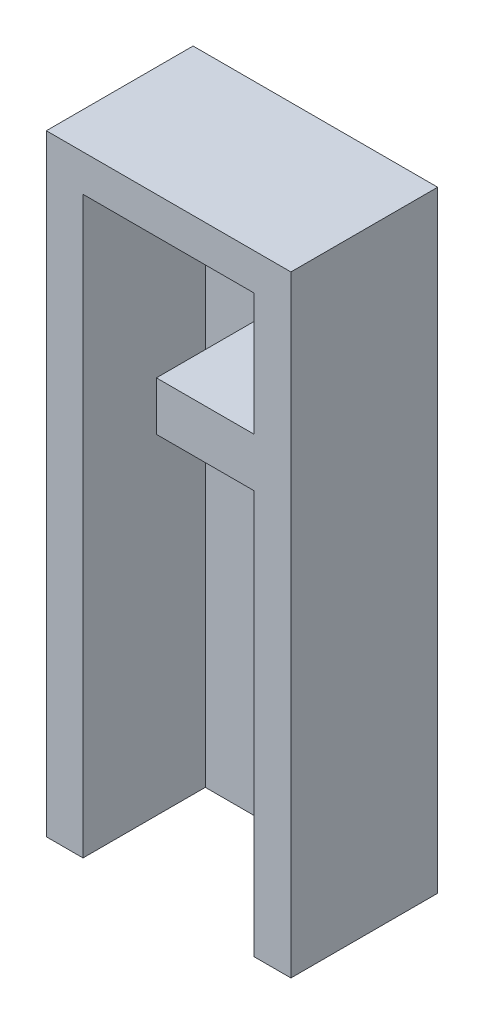
ISO-10303-21;
HEADER;
FILE_DESCRIPTION(('STEP AP214'),'2;1');
FILE_NAME('part.step','',(''),(''),'','','');
FILE_SCHEMA(('AUTOMOTIVE_DESIGN { 1 0 10303 214 1 1 1 1 }'));
ENDSEC;
DATA;
#1=APPLICATION_CONTEXT('core data for automotive mechanical design processes');
#2=APPLICATION_PROTOCOL_DEFINITION('international standard','automotive_design',2000,#1);
#3=PRODUCT_CONTEXT('',#1,'mechanical');
#4=PRODUCT('Part','Part','',(#3));
#5=PRODUCT_RELATED_PRODUCT_CATEGORY('part','',(#4));
#6=PRODUCT_DEFINITION_FORMATION('','',#4);
#7=PRODUCT_DEFINITION_CONTEXT('part definition',#1,'design');
#8=PRODUCT_DEFINITION('design','',#6,#7);
#9=PRODUCT_DEFINITION_SHAPE('','',#8);
#10=(LENGTH_UNIT() NAMED_UNIT(*) SI_UNIT(.MILLI.,.METRE.));
#11=(NAMED_UNIT(*) PLANE_ANGLE_UNIT() SI_UNIT($,.RADIAN.));
#12=(NAMED_UNIT(*) SI_UNIT($,.STERADIAN.) SOLID_ANGLE_UNIT());
#13=UNCERTAINTY_MEASURE_WITH_UNIT(LENGTH_MEASURE(1.E-05),#10,'distance_accuracy_value','');
#14=(GEOMETRIC_REPRESENTATION_CONTEXT(3) GLOBAL_UNCERTAINTY_ASSIGNED_CONTEXT((#13)) GLOBAL_UNIT_ASSIGNED_CONTEXT((#10,
#11,#12)) REPRESENTATION_CONTEXT('',''));
#15=CARTESIAN_POINT('',(0.,0.,0.));
#16=DIRECTION('',(0.,0.,1.));
#17=DIRECTION('',(1.,0.,0.));
#18=AXIS2_PLACEMENT_3D('',#15,#16,#17);
#19=CARTESIAN_POINT('',(0.,0.,5.));
#20=DIRECTION('',(0.,0.,-1.));
#21=DIRECTION('',(-1.,0.,0.));
#22=AXIS2_PLACEMENT_3D('',#19,#20,#21);
#23=PLANE('',#22);
#24=DIRECTION('',(1.,0.,0.));
#25=VECTOR('',#24,1.);
#26=CARTESIAN_POINT('',(-1.5,-1.5,5.));
#27=LINE('',#26,#25);
#28=CARTESIAN_POINT('',(-1.5,-1.5,5.));
#29=VERTEX_POINT('',#28);
#30=CARTESIAN_POINT('',(0.,-1.5,5.));
#31=VERTEX_POINT('',#30);
#32=EDGE_CURVE('E140',#29,#31,#27,.T.);
#33=ORIENTED_EDGE('',*,*,#32,.T.);
#34=DIRECTION('',(0.,-1.,0.));
#35=VECTOR('',#34,1.);
#36=CARTESIAN_POINT('',(0.,0.,5.));
#37=LINE('',#36,#35);
#38=CARTESIAN_POINT('',(0.,22.,5.));
#39=VERTEX_POINT('',#38);
#40=EDGE_CURVE('E126',#39,#31,#37,.T.);
#41=ORIENTED_EDGE('',*,*,#40,.F.);
#42=DIRECTION('',(-1.,0.,0.));
#43=VECTOR('',#42,1.);
#44=CARTESIAN_POINT('',(0.,22.,5.));
#45=LINE('',#44,#43);
#46=CARTESIAN_POINT('',(7.,22.,5.));
#47=VERTEX_POINT('',#46);
#48=EDGE_CURVE('E196',#47,#39,#45,.T.);
#49=ORIENTED_EDGE('',*,*,#48,.F.);
#50=DIRECTION('',(0.,1.,0.));
#51=VECTOR('',#50,1.);
#52=CARTESIAN_POINT('',(7.,17.,5.));
#53=LINE('',#52,#51);
#54=CARTESIAN_POINT('',(7.,17.,5.));
#55=VERTEX_POINT('',#54);
#56=EDGE_CURVE('E194',#55,#47,#53,.T.);
#57=ORIENTED_EDGE('',*,*,#56,.F.);
#58=DIRECTION('',(1.,0.,0.));
#59=VECTOR('',#58,1.);
#60=CARTESIAN_POINT('',(7.,17.,5.));
#61=LINE('',#60,#59);
#62=CARTESIAN_POINT('',(3.,17.,5.));
#63=VERTEX_POINT('',#62);
#64=EDGE_CURVE('E192',#63,#55,#61,.T.);
#65=ORIENTED_EDGE('',*,*,#64,.F.);
#66=DIRECTION('',(0.,1.,0.));
#67=VECTOR('',#66,1.);
#68=CARTESIAN_POINT('',(3.,17.,5.));
#69=LINE('',#68,#67);
#70=CARTESIAN_POINT('',(3.,15.,5.));
#71=VERTEX_POINT('',#70);
#72=EDGE_CURVE('E190',#71,#63,#69,.T.);
#73=ORIENTED_EDGE('',*,*,#72,.F.);
#74=DIRECTION('',(-1.,0.,0.));
#75=VECTOR('',#74,1.);
#76=CARTESIAN_POINT('',(3.,15.,5.));
#77=LINE('',#76,#75);
#78=CARTESIAN_POINT('',(7.,15.,5.));
#79=VERTEX_POINT('',#78);
#80=EDGE_CURVE('E188',#79,#71,#77,.T.);
#81=ORIENTED_EDGE('',*,*,#80,.F.);
#82=DIRECTION('',(0.,1.,0.));
#83=VECTOR('',#82,1.);
#84=CARTESIAN_POINT('',(7.,0.,5.));
#85=LINE('',#84,#83);
#86=CARTESIAN_POINT('',(7.,-1.5,5.));
#87=VERTEX_POINT('',#86);
#88=EDGE_CURVE('E135',#87,#79,#85,.T.);
#89=ORIENTED_EDGE('',*,*,#88,.F.);
#90=CARTESIAN_POINT('',(8.5,-1.5,5.));
#91=VERTEX_POINT('',#90);
#92=EDGE_CURVE('E151',#87,#91,#27,.T.);
#93=ORIENTED_EDGE('',*,*,#92,.T.);
#94=DIRECTION('',(0.,1.,0.));
#95=VECTOR('',#94,1.);
#96=CARTESIAN_POINT('',(8.5,-1.5,5.));
#97=LINE('',#96,#95);
#98=CARTESIAN_POINT('',(8.5,23.5,5.));
#99=VERTEX_POINT('',#98);
#100=EDGE_CURVE('E150',#91,#99,#97,.T.);
#101=ORIENTED_EDGE('',*,*,#100,.T.);
#102=DIRECTION('',(-1.,0.,0.));
#103=VECTOR('',#102,1.);
#104=CARTESIAN_POINT('',(-1.5,23.5,5.));
#105=LINE('',#104,#103);
#106=CARTESIAN_POINT('',(-1.5,23.5,5.));
#107=VERTEX_POINT('',#106);
#108=EDGE_CURVE('E153',#99,#107,#105,.T.);
#109=ORIENTED_EDGE('',*,*,#108,.T.);
#110=DIRECTION('',(0.,-1.,0.));
#111=VECTOR('',#110,1.);
#112=CARTESIAN_POINT('',(-1.5,-1.5,5.));
#113=LINE('',#112,#111);
#114=EDGE_CURVE('E148',#107,#29,#113,.T.);
#115=ORIENTED_EDGE('',*,*,#114,.T.);
#116=EDGE_LOOP('',(#33,#41,#49,#57,#65,#73,#81,#89,#93,#101,#109,#115));
#117=FACE_BOUND('',#116,.T.);
#118=ADVANCED_FACE('F39',(#117),#23,.F.);
#119=CARTESIAN_POINT('',(-1.5,-1.5,5.));
#120=DIRECTION('',(1.,0.,0.));
#121=DIRECTION('',(0.,0.,-1.));
#122=AXIS2_PLACEMENT_3D('',#119,#120,#121);
#123=PLANE('',#122);
#124=DIRECTION('',(0.,0.,-1.));
#125=VECTOR('',#124,1.);
#126=CARTESIAN_POINT('',(-1.5,23.5,5.));
#127=LINE('',#126,#125);
#128=CARTESIAN_POINT('',(-1.5,23.5,-1.));
#129=VERTEX_POINT('',#128);
#130=EDGE_CURVE('E159',#107,#129,#127,.T.);
#131=ORIENTED_EDGE('',*,*,#130,.T.);
#132=DIRECTION('',(0.,1.,0.));
#133=VECTOR('',#132,1.);
#134=CARTESIAN_POINT('',(-1.5,23.5,-1.));
#135=LINE('',#134,#133);
#136=CARTESIAN_POINT('',(-1.5,-1.5,-1.));
#137=VERTEX_POINT('',#136);
#138=EDGE_CURVE('E176',#137,#129,#135,.T.);
#139=ORIENTED_EDGE('',*,*,#138,.F.);
#140=DIRECTION('',(0.,0.,-1.));
#141=VECTOR('',#140,1.);
#142=CARTESIAN_POINT('',(-1.5,-1.5,5.));
#143=LINE('',#142,#141);
#144=EDGE_CURVE('E11',#29,#137,#143,.T.);
#145=ORIENTED_EDGE('',*,*,#144,.F.);
#146=ORIENTED_EDGE('',*,*,#114,.F.);
#147=EDGE_LOOP('',(#131,#139,#145,#146));
#148=FACE_BOUND('',#147,.T.);
#149=ADVANCED_FACE('F41',(#148),#123,.F.);
#150=CARTESIAN_POINT('',(-1.5,-1.5,5.));
#151=DIRECTION('',(0.,1.,0.));
#152=DIRECTION('',(0.,0.,1.));
#153=AXIS2_PLACEMENT_3D('',#150,#151,#152);
#154=PLANE('',#153);
#155=DIRECTION('',(-1.,0.,0.));
#156=VECTOR('',#155,1.);
#157=CARTESIAN_POINT('',(-1.5,-1.5,0.));
#158=LINE('',#157,#156);
#159=CARTESIAN_POINT('',(7.,-1.5,0.));
#160=VERTEX_POINT('',#159);
#161=CARTESIAN_POINT('',(0.,-1.5,0.));
#162=VERTEX_POINT('',#161);
#163=EDGE_CURVE('E144',#160,#162,#158,.T.);
#164=ORIENTED_EDGE('',*,*,#163,.T.);
#165=DIRECTION('',(0.,0.,1.));
#166=VECTOR('',#165,1.);
#167=CARTESIAN_POINT('',(0.,-1.5,5.));
#168=LINE('',#167,#166);
#169=EDGE_CURVE('E129',#162,#31,#168,.T.);
#170=ORIENTED_EDGE('',*,*,#169,.T.);
#171=ORIENTED_EDGE('',*,*,#32,.F.);
#172=ORIENTED_EDGE('',*,*,#144,.T.);
#173=DIRECTION('',(-1.,0.,0.));
#174=VECTOR('',#173,1.);
#175=CARTESIAN_POINT('',(8.5,-1.5,-1.));
#176=LINE('',#175,#174);
#177=CARTESIAN_POINT('',(8.5,-1.5,-1.));
#178=VERTEX_POINT('',#177);
#179=EDGE_CURVE('E172',#178,#137,#176,.T.);
#180=ORIENTED_EDGE('',*,*,#179,.F.);
#181=DIRECTION('',(0.,0.,-1.));
#182=VECTOR('',#181,1.);
#183=CARTESIAN_POINT('',(8.5,-1.5,5.));
#184=LINE('',#183,#182);
#185=EDGE_CURVE('E47',#91,#178,#184,.T.);
#186=ORIENTED_EDGE('',*,*,#185,.F.);
#187=ORIENTED_EDGE('',*,*,#92,.F.);
#188=DIRECTION('',(0.,0.,-1.));
#189=VECTOR('',#188,1.);
#190=CARTESIAN_POINT('',(7.,-1.5,5.));
#191=LINE('',#190,#189);
#192=EDGE_CURVE('E236',#87,#160,#191,.T.);
#193=ORIENTED_EDGE('',*,*,#192,.T.);
#194=EDGE_LOOP('',(#164,#170,#171,#172,#180,#186,#187,#193));
#195=FACE_BOUND('',#194,.T.);
#196=ADVANCED_FACE('F139',(#195),#154,.F.);
#197=CARTESIAN_POINT('',(8.5,-1.5,5.));
#198=DIRECTION('',(-1.,0.,0.));
#199=DIRECTION('',(0.,0.,1.));
#200=AXIS2_PLACEMENT_3D('',#197,#198,#199);
#201=PLANE('',#200);
#202=ORIENTED_EDGE('',*,*,#185,.T.);
#203=DIRECTION('',(0.,-1.,0.));
#204=VECTOR('',#203,1.);
#205=CARTESIAN_POINT('',(8.5,23.5,-1.));
#206=LINE('',#205,#204);
#207=CARTESIAN_POINT('',(8.5,23.5,-1.));
#208=VERTEX_POINT('',#207);
#209=EDGE_CURVE('E145',#208,#178,#206,.T.);
#210=ORIENTED_EDGE('',*,*,#209,.F.);
#211=DIRECTION('',(0.,0.,-1.));
#212=VECTOR('',#211,1.);
#213=CARTESIAN_POINT('',(8.5,23.5,5.));
#214=LINE('',#213,#212);
#215=EDGE_CURVE('E161',#99,#208,#214,.T.);
#216=ORIENTED_EDGE('',*,*,#215,.F.);
#217=ORIENTED_EDGE('',*,*,#100,.F.);
#218=EDGE_LOOP('',(#202,#210,#216,#217));
#219=FACE_BOUND('',#218,.T.);
#220=ADVANCED_FACE('F167',(#219),#201,.F.);
#221=CARTESIAN_POINT('',(-1.5,23.5,5.));
#222=DIRECTION('',(0.,-1.,0.));
#223=DIRECTION('',(0.,0.,-1.));
#224=AXIS2_PLACEMENT_3D('',#221,#222,#223);
#225=PLANE('',#224);
#226=ORIENTED_EDGE('',*,*,#215,.T.);
#227=DIRECTION('',(1.,0.,0.));
#228=VECTOR('',#227,1.);
#229=CARTESIAN_POINT('',(8.5,23.5,-1.));
#230=LINE('',#229,#228);
#231=EDGE_CURVE('E181',#129,#208,#230,.T.);
#232=ORIENTED_EDGE('',*,*,#231,.F.);
#233=ORIENTED_EDGE('',*,*,#130,.F.);
#234=ORIENTED_EDGE('',*,*,#108,.F.);
#235=EDGE_LOOP('',(#226,#232,#233,#234));
#236=FACE_BOUND('',#235,.T.);
#237=ADVANCED_FACE('F269',(#236),#225,.F.);
#238=CARTESIAN_POINT('',(0.,0.,5.));
#239=DIRECTION('',(1.,0.,0.));
#240=DIRECTION('',(0.,0.,-1.));
#241=AXIS2_PLACEMENT_3D('',#238,#239,#240);
#242=PLANE('',#241);
#243=DIRECTION('',(0.,-1.,0.));
#244=VECTOR('',#243,1.);
#245=CARTESIAN_POINT('',(0.,0.,0.));
#246=LINE('',#245,#244);
#247=CARTESIAN_POINT('',(0.,22.,0.));
#248=VERTEX_POINT('',#247);
#249=EDGE_CURVE('E62',#248,#162,#246,.T.);
#250=ORIENTED_EDGE('',*,*,#249,.F.);
#251=DIRECTION('',(0.,0.,-1.));
#252=VECTOR('',#251,1.);
#253=CARTESIAN_POINT('',(0.,22.,5.));
#254=LINE('',#253,#252);
#255=EDGE_CURVE('E131',#39,#248,#254,.T.);
#256=ORIENTED_EDGE('',*,*,#255,.F.);
#257=ORIENTED_EDGE('',*,*,#40,.T.);
#258=ORIENTED_EDGE('',*,*,#169,.F.);
#259=EDGE_LOOP('',(#250,#256,#257,#258));
#260=FACE_BOUND('',#259,.T.);
#261=ADVANCED_FACE('F128',(#260),#242,.T.);
#262=CARTESIAN_POINT('',(7.,0.,5.));
#263=DIRECTION('',(-1.,0.,0.));
#264=DIRECTION('',(0.,0.,1.));
#265=AXIS2_PLACEMENT_3D('',#262,#263,#264);
#266=PLANE('',#265);
#267=DIRECTION('',(0.,1.,0.));
#268=VECTOR('',#267,1.);
#269=CARTESIAN_POINT('',(7.,0.,0.));
#270=LINE('',#269,#268);
#271=CARTESIAN_POINT('',(7.,15.,0.));
#272=VERTEX_POINT('',#271);
#273=EDGE_CURVE('E199',#160,#272,#270,.T.);
#274=ORIENTED_EDGE('',*,*,#273,.F.);
#275=ORIENTED_EDGE('',*,*,#192,.F.);
#276=ORIENTED_EDGE('',*,*,#88,.T.);
#277=DIRECTION('',(0.,0.,-1.));
#278=VECTOR('',#277,1.);
#279=CARTESIAN_POINT('',(7.,15.,5.));
#280=LINE('',#279,#278);
#281=EDGE_CURVE('E223',#79,#272,#280,.T.);
#282=ORIENTED_EDGE('',*,*,#281,.T.);
#283=EDGE_LOOP('',(#274,#275,#276,#282));
#284=FACE_BOUND('',#283,.T.);
#285=ADVANCED_FACE('F227',(#284),#266,.T.);
#286=CARTESIAN_POINT('',(3.,15.,5.));
#287=DIRECTION('',(0.,-1.,0.));
#288=DIRECTION('',(0.,0.,-1.));
#289=AXIS2_PLACEMENT_3D('',#286,#287,#288);
#290=PLANE('',#289);
#291=DIRECTION('',(-1.,0.,0.));
#292=VECTOR('',#291,1.);
#293=CARTESIAN_POINT('',(3.,15.,0.));
#294=LINE('',#293,#292);
#295=CARTESIAN_POINT('',(3.,15.,0.));
#296=VERTEX_POINT('',#295);
#297=EDGE_CURVE('E202',#272,#296,#294,.T.);
#298=ORIENTED_EDGE('',*,*,#297,.F.);
#299=ORIENTED_EDGE('',*,*,#281,.F.);
#300=ORIENTED_EDGE('',*,*,#80,.T.);
#301=DIRECTION('',(0.,0.,-1.));
#302=VECTOR('',#301,1.);
#303=CARTESIAN_POINT('',(3.,15.,5.));
#304=LINE('',#303,#302);
#305=EDGE_CURVE('E222',#71,#296,#304,.T.);
#306=ORIENTED_EDGE('',*,*,#305,.T.);
#307=EDGE_LOOP('',(#298,#299,#300,#306));
#308=FACE_BOUND('',#307,.T.);
#309=ADVANCED_FACE('F231',(#308),#290,.T.);
#310=CARTESIAN_POINT('',(3.,17.,5.));
#311=DIRECTION('',(-1.,0.,0.));
#312=DIRECTION('',(0.,-1.,0.));
#313=AXIS2_PLACEMENT_3D('',#310,#311,#312);
#314=PLANE('',#313);
#315=DIRECTION('',(0.,1.,0.));
#316=VECTOR('',#315,1.);
#317=CARTESIAN_POINT('',(3.,17.,0.));
#318=LINE('',#317,#316);
#319=CARTESIAN_POINT('',(3.,17.,0.));
#320=VERTEX_POINT('',#319);
#321=EDGE_CURVE('E205',#296,#320,#318,.T.);
#322=ORIENTED_EDGE('',*,*,#321,.F.);
#323=ORIENTED_EDGE('',*,*,#305,.F.);
#324=ORIENTED_EDGE('',*,*,#72,.T.);
#325=DIRECTION('',(0.,0.,-1.));
#326=VECTOR('',#325,1.);
#327=CARTESIAN_POINT('',(3.,17.,5.));
#328=LINE('',#327,#326);
#329=EDGE_CURVE('E220',#63,#320,#328,.T.);
#330=ORIENTED_EDGE('',*,*,#329,.T.);
#331=EDGE_LOOP('',(#322,#323,#324,#330));
#332=FACE_BOUND('',#331,.T.);
#333=ADVANCED_FACE('F241',(#332),#314,.T.);
#334=CARTESIAN_POINT('',(7.,17.,5.));
#335=DIRECTION('',(0.,1.,0.));
#336=DIRECTION('',(0.,0.,1.));
#337=AXIS2_PLACEMENT_3D('',#334,#335,#336);
#338=PLANE('',#337);
#339=DIRECTION('',(1.,0.,0.));
#340=VECTOR('',#339,1.);
#341=CARTESIAN_POINT('',(7.,17.,0.));
#342=LINE('',#341,#340);
#343=CARTESIAN_POINT('',(7.,17.,0.));
#344=VERTEX_POINT('',#343);
#345=EDGE_CURVE('E208',#320,#344,#342,.T.);
#346=ORIENTED_EDGE('',*,*,#345,.F.);
#347=ORIENTED_EDGE('',*,*,#329,.F.);
#348=ORIENTED_EDGE('',*,*,#64,.T.);
#349=DIRECTION('',(0.,0.,-1.));
#350=VECTOR('',#349,1.);
#351=CARTESIAN_POINT('',(7.,17.,5.));
#352=LINE('',#351,#350);
#353=EDGE_CURVE('E218',#55,#344,#352,.T.);
#354=ORIENTED_EDGE('',*,*,#353,.T.);
#355=EDGE_LOOP('',(#346,#347,#348,#354));
#356=FACE_BOUND('',#355,.T.);
#357=ADVANCED_FACE('F246',(#356),#338,.T.);
#358=CARTESIAN_POINT('',(7.,17.,5.));
#359=DIRECTION('',(-1.,0.,0.));
#360=DIRECTION('',(0.,0.,1.));
#361=AXIS2_PLACEMENT_3D('',#358,#359,#360);
#362=PLANE('',#361);
#363=DIRECTION('',(0.,1.,0.));
#364=VECTOR('',#363,1.);
#365=CARTESIAN_POINT('',(7.,17.,0.));
#366=LINE('',#365,#364);
#367=CARTESIAN_POINT('',(7.,22.,0.));
#368=VERTEX_POINT('',#367);
#369=EDGE_CURVE('E211',#344,#368,#366,.T.);
#370=ORIENTED_EDGE('',*,*,#369,.F.);
#371=ORIENTED_EDGE('',*,*,#353,.F.);
#372=ORIENTED_EDGE('',*,*,#56,.T.);
#373=DIRECTION('',(0.,0.,-1.));
#374=VECTOR('',#373,1.);
#375=CARTESIAN_POINT('',(7.,22.,5.));
#376=LINE('',#375,#374);
#377=EDGE_CURVE('E54',#47,#368,#376,.T.);
#378=ORIENTED_EDGE('',*,*,#377,.T.);
#379=EDGE_LOOP('',(#370,#371,#372,#378));
#380=FACE_BOUND('',#379,.T.);
#381=ADVANCED_FACE('F250',(#380),#362,.T.);
#382=CARTESIAN_POINT('',(0.,22.,5.));
#383=DIRECTION('',(0.,-1.,0.));
#384=DIRECTION('',(0.,0.,-1.));
#385=AXIS2_PLACEMENT_3D('',#382,#383,#384);
#386=PLANE('',#385);
#387=DIRECTION('',(-1.,0.,0.));
#388=VECTOR('',#387,1.);
#389=CARTESIAN_POINT('',(0.,22.,0.));
#390=LINE('',#389,#388);
#391=EDGE_CURVE('E136',#368,#248,#390,.T.);
#392=ORIENTED_EDGE('',*,*,#391,.F.);
#393=ORIENTED_EDGE('',*,*,#377,.F.);
#394=ORIENTED_EDGE('',*,*,#48,.T.);
#395=ORIENTED_EDGE('',*,*,#255,.T.);
#396=EDGE_LOOP('',(#392,#393,#394,#395));
#397=FACE_BOUND('',#396,.T.);
#398=ADVANCED_FACE('F251',(#397),#386,.T.);
#399=CARTESIAN_POINT('',(0.,0.,0.));
#400=DIRECTION('',(0.,0.,-1.));
#401=DIRECTION('',(-1.,0.,0.));
#402=AXIS2_PLACEMENT_3D('',#399,#400,#401);
#403=PLANE('',#402);
#404=ORIENTED_EDGE('',*,*,#369,.T.);
#405=ORIENTED_EDGE('',*,*,#391,.T.);
#406=ORIENTED_EDGE('',*,*,#249,.T.);
#407=ORIENTED_EDGE('',*,*,#163,.F.);
#408=ORIENTED_EDGE('',*,*,#273,.T.);
#409=ORIENTED_EDGE('',*,*,#297,.T.);
#410=ORIENTED_EDGE('',*,*,#321,.T.);
#411=ORIENTED_EDGE('',*,*,#345,.T.);
#412=EDGE_LOOP('',(#404,#405,#406,#407,#408,#409,#410,#411));
#413=FACE_BOUND('',#412,.T.);
#414=ADVANCED_FACE('F235',(#413),#403,.F.);
#415=CARTESIAN_POINT('',(0.,0.,-1.));
#416=DIRECTION('',(0.,0.,-1.));
#417=DIRECTION('',(-1.,0.,0.));
#418=AXIS2_PLACEMENT_3D('',#415,#416,#417);
#419=PLANE('',#418);
#420=ORIENTED_EDGE('',*,*,#209,.T.);
#421=ORIENTED_EDGE('',*,*,#179,.T.);
#422=ORIENTED_EDGE('',*,*,#138,.T.);
#423=ORIENTED_EDGE('',*,*,#231,.T.);
#424=EDGE_LOOP('',(#420,#421,#422,#423));
#425=FACE_BOUND('',#424,.T.);
#426=ADVANCED_FACE('F179',(#425),#419,.T.);
#427=CLOSED_SHELL('',(#118,#149,#196,#220,#237,#261,#285,#309,#333,#357,#381,#398,#414,#426));
#428=MANIFOLD_SOLID_BREP('B2',#427);
#429=ADVANCED_BREP_SHAPE_REPRESENTATION('',(#18,#428),#14);
#430=SHAPE_DEFINITION_REPRESENTATION(#9,#429);
ENDSEC;
END-ISO-10303-21;
